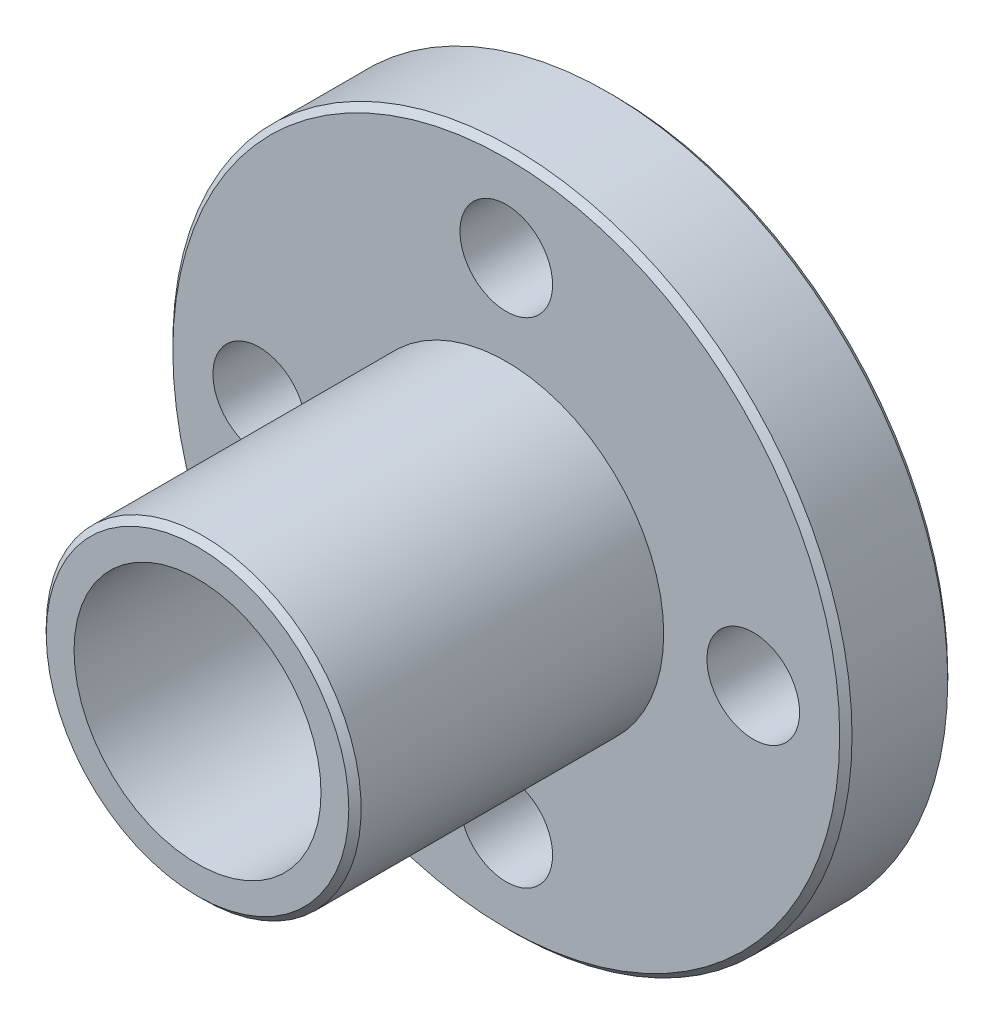
ISO-10303-21;
HEADER;
FILE_DESCRIPTION(('STEP AP214'),'2;1');
FILE_NAME('part.step','',(''),(''),'','','');
FILE_SCHEMA(('AUTOMOTIVE_DESIGN { 1 0 10303 214 1 1 1 1 }'));
ENDSEC;
DATA;
#1=APPLICATION_CONTEXT('core data for automotive mechanical design processes');
#2=APPLICATION_PROTOCOL_DEFINITION('international standard','automotive_design',2000,#1);
#3=PRODUCT_CONTEXT('',#1,'mechanical');
#4=PRODUCT('Part','Part','',(#3));
#5=PRODUCT_RELATED_PRODUCT_CATEGORY('part','',(#4));
#6=PRODUCT_DEFINITION_FORMATION('','',#4);
#7=PRODUCT_DEFINITION_CONTEXT('part definition',#1,'design');
#8=PRODUCT_DEFINITION('design','',#6,#7);
#9=PRODUCT_DEFINITION_SHAPE('','',#8);
#10=(LENGTH_UNIT() NAMED_UNIT(*) SI_UNIT(.MILLI.,.METRE.));
#11=(NAMED_UNIT(*) PLANE_ANGLE_UNIT() SI_UNIT($,.RADIAN.));
#12=(NAMED_UNIT(*) SI_UNIT($,.STERADIAN.) SOLID_ANGLE_UNIT());
#13=UNCERTAINTY_MEASURE_WITH_UNIT(LENGTH_MEASURE(1.E-05),#10,'distance_accuracy_value','');
#14=(GEOMETRIC_REPRESENTATION_CONTEXT(3) GLOBAL_UNCERTAINTY_ASSIGNED_CONTEXT((#13)) GLOBAL_UNIT_ASSIGNED_CONTEXT((#10,
#11,#12)) REPRESENTATION_CONTEXT('',''));
#15=CARTESIAN_POINT('',(0.,0.,0.));
#16=DIRECTION('',(0.,0.,1.));
#17=DIRECTION('',(1.,0.,0.));
#18=AXIS2_PLACEMENT_3D('',#15,#16,#17);
#19=CARTESIAN_POINT('',(0.,0.,0.));
#20=DIRECTION('',(0.,0.,1.));
#21=DIRECTION('',(1.,0.,0.));
#22=AXIS2_PLACEMENT_3D('',#19,#20,#21);
#23=PLANE('',#22);
#24=CARTESIAN_POINT('',(0.,0.,0.));
#25=DIRECTION('',(0.,0.,1.));
#26=DIRECTION('',(1.,0.,0.));
#27=AXIS2_PLACEMENT_3D('',#24,#25,#26);
#28=CIRCLE('',#27,4.9);
#29=CARTESIAN_POINT('',(4.9,0.,0.));
#30=VERTEX_POINT('',#29);
#31=EDGE_CURVE('E63',#30,#30,#28,.F.);
#32=ORIENTED_EDGE('',*,*,#31,.T.);
#33=EDGE_LOOP('',(#32));
#34=FACE_BOUND('',#33,.T.);
#35=CARTESIAN_POINT('',(0.,0.,0.));
#36=DIRECTION('',(0.,0.,1.));
#37=DIRECTION('',(1.,0.,0.));
#38=AXIS2_PLACEMENT_3D('',#35,#36,#37);
#39=CIRCLE('',#38,4.);
#40=CARTESIAN_POINT('',(4.,0.,0.));
#41=VERTEX_POINT('',#40);
#42=EDGE_CURVE('E89',#41,#41,#39,.T.);
#43=ORIENTED_EDGE('',*,*,#42,.T.);
#44=EDGE_LOOP('',(#43));
#45=FACE_BOUND('',#44,.T.);
#46=ADVANCED_FACE('F36',(#34,#45),#23,.F.);
#47=CARTESIAN_POINT('',(0.,0.,1.5));
#48=DIRECTION('',(0.,0.,-1.));
#49=DIRECTION('',(-1.,0.,0.));
#50=AXIS2_PLACEMENT_3D('',#47,#48,#49);
#51=CYLINDRICAL_SURFACE('',#50,5.1);
#52=CARTESIAN_POINT('',(0.,0.,0.200000000000001));
#53=DIRECTION('',(0.,0.,1.));
#54=DIRECTION('',(1.,0.,0.));
#55=AXIS2_PLACEMENT_3D('',#52,#53,#54);
#56=CIRCLE('',#55,5.1);
#57=CARTESIAN_POINT('',(5.1,0.,0.200000000000001));
#58=VERTEX_POINT('',#57);
#59=EDGE_CURVE('E66',#58,#58,#56,.T.);
#60=ORIENTED_EDGE('',*,*,#59,.T.);
#61=EDGE_LOOP('',(#60));
#62=FACE_BOUND('',#61,.T.);
#63=CARTESIAN_POINT('',(0.,0.,1.5));
#64=DIRECTION('',(0.,0.,1.));
#65=DIRECTION('',(1.,0.,0.));
#66=AXIS2_PLACEMENT_3D('',#63,#64,#65);
#67=CIRCLE('',#66,5.1);
#68=CARTESIAN_POINT('',(5.1,0.,1.5));
#69=VERTEX_POINT('',#68);
#70=EDGE_CURVE('E86',#69,#69,#67,.T.);
#71=ORIENTED_EDGE('',*,*,#70,.F.);
#72=EDGE_LOOP('',(#71));
#73=FACE_BOUND('',#72,.T.);
#74=ADVANCED_FACE('F131',(#62,#73),#51,.T.);
#75=CARTESIAN_POINT('',(0.,0.,1.5));
#76=DIRECTION('',(0.,0.,-1.));
#77=DIRECTION('',(-1.,0.,0.));
#78=AXIS2_PLACEMENT_3D('',#75,#76,#77);
#79=CYLINDRICAL_SURFACE('',#78,4.);
#80=ORIENTED_EDGE('',*,*,#42,.F.);
#81=EDGE_LOOP('',(#80));
#82=FACE_BOUND('',#81,.T.);
#83=CARTESIAN_POINT('',(0.,0.,15.));
#84=DIRECTION('',(0.,0.,-1.));
#85=DIRECTION('',(-1.,0.,0.));
#86=AXIS2_PLACEMENT_3D('',#83,#84,#85);
#87=CIRCLE('',#86,4.);
#88=CARTESIAN_POINT('',(-4.,0.,15.));
#89=VERTEX_POINT('',#88);
#90=EDGE_CURVE('E92',#89,#89,#87,.T.);
#91=ORIENTED_EDGE('',*,*,#90,.F.);
#92=EDGE_LOOP('',(#91));
#93=FACE_BOUND('',#92,.T.);
#94=ADVANCED_FACE('F113',(#82,#93),#79,.F.);
#95=CARTESIAN_POINT('',(0.,0.,5.));
#96=DIRECTION('',(0.,0.,1.));
#97=DIRECTION('',(1.,0.,0.));
#98=AXIS2_PLACEMENT_3D('',#95,#96,#97);
#99=PLANE('',#98);
#100=CARTESIAN_POINT('',(0.,0.,5.));
#101=DIRECTION('',(0.,0.,1.));
#102=DIRECTION('',(1.,0.,0.));
#103=AXIS2_PLACEMENT_3D('',#100,#101,#102);
#104=CIRCLE('',#103,10.8);
#105=CARTESIAN_POINT('',(10.8,0.,5.));
#106=VERTEX_POINT('',#105);
#107=EDGE_CURVE('E48',#106,#106,#104,.T.);
#108=ORIENTED_EDGE('',*,*,#107,.T.);
#109=EDGE_LOOP('',(#108));
#110=FACE_BOUND('',#109,.T.);
#111=CARTESIAN_POINT('',(0.,8.,5.));
#112=DIRECTION('',(0.,0.,1.));
#113=DIRECTION('',(1.,0.,0.));
#114=AXIS2_PLACEMENT_3D('',#111,#112,#113);
#115=CIRCLE('',#114,1.5);
#116=CARTESIAN_POINT('',(1.5,8.,5.));
#117=VERTEX_POINT('',#116);
#118=EDGE_CURVE('E73',#117,#117,#115,.T.);
#119=ORIENTED_EDGE('',*,*,#118,.F.);
#120=EDGE_LOOP('',(#119));
#121=FACE_BOUND('',#120,.T.);
#122=CARTESIAN_POINT('',(-8.,0.,5.));
#123=DIRECTION('',(0.,0.,1.));
#124=DIRECTION('',(1.,0.,0.));
#125=AXIS2_PLACEMENT_3D('',#122,#123,#124);
#126=CIRCLE('',#125,1.50000000000003);
#127=CARTESIAN_POINT('',(-6.49999999999997,0.,5.));
#128=VERTEX_POINT('',#127);
#129=EDGE_CURVE('E74',#128,#128,#126,.T.);
#130=ORIENTED_EDGE('',*,*,#129,.F.);
#131=EDGE_LOOP('',(#130));
#132=FACE_BOUND('',#131,.T.);
#133=CARTESIAN_POINT('',(0.,-8.,5.));
#134=DIRECTION('',(0.,0.,1.));
#135=DIRECTION('',(1.,0.,0.));
#136=AXIS2_PLACEMENT_3D('',#133,#134,#135);
#137=CIRCLE('',#136,1.50000000000005);
#138=CARTESIAN_POINT('',(1.50000000000005,-8.,5.));
#139=VERTEX_POINT('',#138);
#140=EDGE_CURVE('E78',#139,#139,#137,.T.);
#141=ORIENTED_EDGE('',*,*,#140,.F.);
#142=EDGE_LOOP('',(#141));
#143=FACE_BOUND('',#142,.T.);
#144=CARTESIAN_POINT('',(8.,0.,5.));
#145=DIRECTION('',(0.,0.,1.));
#146=DIRECTION('',(1.,0.,0.));
#147=AXIS2_PLACEMENT_3D('',#144,#145,#146);
#148=CIRCLE('',#147,1.50000000000008);
#149=CARTESIAN_POINT('',(9.50000000000008,0.,5.));
#150=VERTEX_POINT('',#149);
#151=EDGE_CURVE('E82',#150,#150,#148,.T.);
#152=ORIENTED_EDGE('',*,*,#151,.F.);
#153=EDGE_LOOP('',(#152));
#154=FACE_BOUND('',#153,.T.);
#155=CARTESIAN_POINT('',(0.,0.,5.));
#156=DIRECTION('',(0.,0.,1.));
#157=DIRECTION('',(1.,0.,0.));
#158=AXIS2_PLACEMENT_3D('',#155,#156,#157);
#159=CIRCLE('',#158,5.1);
#160=CARTESIAN_POINT('',(5.1,0.,5.));
#161=VERTEX_POINT('',#160);
#162=EDGE_CURVE('E69',#161,#161,#159,.T.);
#163=ORIENTED_EDGE('',*,*,#162,.F.);
#164=EDGE_LOOP('',(#163));
#165=FACE_BOUND('',#164,.T.);
#166=ADVANCED_FACE('F109',(#110,#121,#132,#143,#154,#165),#99,.T.);
#167=CARTESIAN_POINT('',(0.,0.,1.5));
#168=DIRECTION('',(0.,0.,1.));
#169=DIRECTION('',(1.,0.,0.));
#170=AXIS2_PLACEMENT_3D('',#167,#168,#169);
#171=PLANE('',#170);
#172=CARTESIAN_POINT('',(0.,0.,1.5));
#173=DIRECTION('',(0.,0.,1.));
#174=DIRECTION('',(1.,0.,0.));
#175=AXIS2_PLACEMENT_3D('',#172,#173,#174);
#176=CIRCLE('',#175,10.8);
#177=CARTESIAN_POINT('',(10.8,0.,1.5));
#178=VERTEX_POINT('',#177);
#179=EDGE_CURVE('E52',#178,#178,#176,.F.);
#180=ORIENTED_EDGE('',*,*,#179,.T.);
#181=EDGE_LOOP('',(#180));
#182=FACE_BOUND('',#181,.T.);
#183=CARTESIAN_POINT('',(0.,8.,1.5));
#184=DIRECTION('',(0.,0.,1.));
#185=DIRECTION('',(1.,0.,0.));
#186=AXIS2_PLACEMENT_3D('',#183,#184,#185);
#187=CIRCLE('',#186,1.5);
#188=CARTESIAN_POINT('',(1.5,8.,1.5));
#189=VERTEX_POINT('',#188);
#190=EDGE_CURVE('E70',#189,#189,#187,.T.);
#191=ORIENTED_EDGE('',*,*,#190,.T.);
#192=EDGE_LOOP('',(#191));
#193=FACE_BOUND('',#192,.T.);
#194=CARTESIAN_POINT('',(-8.,0.,1.5));
#195=DIRECTION('',(0.,0.,1.));
#196=DIRECTION('',(1.,0.,0.));
#197=AXIS2_PLACEMENT_3D('',#194,#195,#196);
#198=CIRCLE('',#197,1.50000000000003);
#199=CARTESIAN_POINT('',(-6.49999999999997,0.,1.5));
#200=VERTEX_POINT('',#199);
#201=EDGE_CURVE('E75',#200,#200,#198,.T.);
#202=ORIENTED_EDGE('',*,*,#201,.T.);
#203=EDGE_LOOP('',(#202));
#204=FACE_BOUND('',#203,.T.);
#205=CARTESIAN_POINT('',(0.,-8.,1.5));
#206=DIRECTION('',(0.,0.,1.));
#207=DIRECTION('',(1.,0.,0.));
#208=AXIS2_PLACEMENT_3D('',#205,#206,#207);
#209=CIRCLE('',#208,1.50000000000005);
#210=CARTESIAN_POINT('',(1.50000000000005,-8.,1.5));
#211=VERTEX_POINT('',#210);
#212=EDGE_CURVE('E79',#211,#211,#209,.T.);
#213=ORIENTED_EDGE('',*,*,#212,.T.);
#214=EDGE_LOOP('',(#213));
#215=FACE_BOUND('',#214,.T.);
#216=CARTESIAN_POINT('',(8.,0.,1.5));
#217=DIRECTION('',(0.,0.,1.));
#218=DIRECTION('',(1.,0.,0.));
#219=AXIS2_PLACEMENT_3D('',#216,#217,#218);
#220=CIRCLE('',#219,1.50000000000008);
#221=CARTESIAN_POINT('',(9.50000000000008,0.,1.5));
#222=VERTEX_POINT('',#221);
#223=EDGE_CURVE('E83',#222,#222,#220,.T.);
#224=ORIENTED_EDGE('',*,*,#223,.T.);
#225=EDGE_LOOP('',(#224));
#226=FACE_BOUND('',#225,.T.);
#227=ORIENTED_EDGE('',*,*,#70,.T.);
#228=EDGE_LOOP('',(#227));
#229=FACE_BOUND('',#228,.T.);
#230=ADVANCED_FACE('F112',(#182,#193,#204,#215,#226,#229),#171,.F.);
#231=CARTESIAN_POINT('',(0.,0.,5.));
#232=DIRECTION('',(0.,0.,-1.));
#233=DIRECTION('',(-1.,0.,0.));
#234=AXIS2_PLACEMENT_3D('',#231,#232,#233);
#235=CYLINDRICAL_SURFACE('',#234,11.);
#236=CARTESIAN_POINT('',(0.,0.,1.7));
#237=DIRECTION('',(0.,0.,1.));
#238=DIRECTION('',(1.,0.,0.));
#239=AXIS2_PLACEMENT_3D('',#236,#237,#238);
#240=CIRCLE('',#239,11.);
#241=CARTESIAN_POINT('',(11.,0.,1.7));
#242=VERTEX_POINT('',#241);
#243=EDGE_CURVE('E57',#242,#242,#240,.T.);
#244=ORIENTED_EDGE('',*,*,#243,.T.);
#245=EDGE_LOOP('',(#244));
#246=FACE_BOUND('',#245,.T.);
#247=CARTESIAN_POINT('',(0.,0.,4.79999999999999));
#248=DIRECTION('',(0.,0.,1.));
#249=DIRECTION('',(1.,0.,0.));
#250=AXIS2_PLACEMENT_3D('',#247,#248,#249);
#251=CIRCLE('',#250,11.);
#252=CARTESIAN_POINT('',(11.,0.,4.79999999999999));
#253=VERTEX_POINT('',#252);
#254=EDGE_CURVE('E60',#253,#253,#251,.F.);
#255=ORIENTED_EDGE('',*,*,#254,.T.);
#256=EDGE_LOOP('',(#255));
#257=FACE_BOUND('',#256,.T.);
#258=ADVANCED_FACE('F121',(#246,#257),#235,.T.);
#259=CARTESIAN_POINT('',(0.,0.,15.));
#260=DIRECTION('',(0.,0.,-1.));
#261=DIRECTION('',(-1.,0.,0.));
#262=AXIS2_PLACEMENT_3D('',#259,#260,#261);
#263=CYLINDRICAL_SURFACE('',#262,5.1);
#264=CARTESIAN_POINT('',(0.,0.,14.8));
#265=DIRECTION('',(0.,0.,-1.));
#266=DIRECTION('',(-1.,0.,0.));
#267=AXIS2_PLACEMENT_3D('',#264,#265,#266);
#268=CIRCLE('',#267,5.1);
#269=CARTESIAN_POINT('',(-5.1,0.,14.8));
#270=VERTEX_POINT('',#269);
#271=EDGE_CURVE('E44',#270,#270,#268,.T.);
#272=ORIENTED_EDGE('',*,*,#271,.T.);
#273=EDGE_LOOP('',(#272));
#274=FACE_BOUND('',#273,.T.);
#275=ORIENTED_EDGE('',*,*,#162,.T.);
#276=EDGE_LOOP('',(#275));
#277=FACE_BOUND('',#276,.T.);
#278=ADVANCED_FACE('F118',(#274,#277),#263,.T.);
#279=CARTESIAN_POINT('',(0.,0.,15.));
#280=DIRECTION('',(0.,0.,-1.));
#281=DIRECTION('',(-1.,0.,0.));
#282=AXIS2_PLACEMENT_3D('',#279,#280,#281);
#283=PLANE('',#282);
#284=CARTESIAN_POINT('',(0.,0.,15.));
#285=DIRECTION('',(0.,0.,-1.));
#286=DIRECTION('',(-1.,0.,0.));
#287=AXIS2_PLACEMENT_3D('',#284,#285,#286);
#288=CIRCLE('',#287,4.9);
#289=CARTESIAN_POINT('',(-4.9,0.,15.));
#290=VERTEX_POINT('',#289);
#291=EDGE_CURVE('E10',#290,#290,#288,.F.);
#292=ORIENTED_EDGE('',*,*,#291,.T.);
#293=EDGE_LOOP('',(#292));
#294=FACE_BOUND('',#293,.T.);
#295=ORIENTED_EDGE('',*,*,#90,.T.);
#296=EDGE_LOOP('',(#295));
#297=FACE_BOUND('',#296,.T.);
#298=ADVANCED_FACE('F120',(#294,#297),#283,.F.);
#299=CARTESIAN_POINT('',(8.,0.,15.));
#300=DIRECTION('',(0.,0.,-1.));
#301=DIRECTION('',(-1.,0.,0.));
#302=AXIS2_PLACEMENT_3D('',#299,#300,#301);
#303=CYLINDRICAL_SURFACE('',#302,1.50000000000008);
#304=ORIENTED_EDGE('',*,*,#151,.T.);
#305=EDGE_LOOP('',(#304));
#306=FACE_BOUND('',#305,.T.);
#307=ORIENTED_EDGE('',*,*,#223,.F.);
#308=EDGE_LOOP('',(#307));
#309=FACE_BOUND('',#308,.T.);
#310=ADVANCED_FACE('F106',(#306,#309),#303,.F.);
#311=CARTESIAN_POINT('',(0.,-8.,15.));
#312=DIRECTION('',(0.,0.,-1.));
#313=DIRECTION('',(-1.,0.,0.));
#314=AXIS2_PLACEMENT_3D('',#311,#312,#313);
#315=CYLINDRICAL_SURFACE('',#314,1.50000000000005);
#316=ORIENTED_EDGE('',*,*,#140,.T.);
#317=EDGE_LOOP('',(#316));
#318=FACE_BOUND('',#317,.T.);
#319=ORIENTED_EDGE('',*,*,#212,.F.);
#320=EDGE_LOOP('',(#319));
#321=FACE_BOUND('',#320,.T.);
#322=ADVANCED_FACE('F176',(#318,#321),#315,.F.);
#323=CARTESIAN_POINT('',(-8.,0.,15.));
#324=DIRECTION('',(0.,0.,-1.));
#325=DIRECTION('',(-1.,0.,0.));
#326=AXIS2_PLACEMENT_3D('',#323,#324,#325);
#327=CYLINDRICAL_SURFACE('',#326,1.50000000000003);
#328=ORIENTED_EDGE('',*,*,#129,.T.);
#329=EDGE_LOOP('',(#328));
#330=FACE_BOUND('',#329,.T.);
#331=ORIENTED_EDGE('',*,*,#201,.F.);
#332=EDGE_LOOP('',(#331));
#333=FACE_BOUND('',#332,.T.);
#334=ADVANCED_FACE('F179',(#330,#333),#327,.F.);
#335=CARTESIAN_POINT('',(0.,8.,15.));
#336=DIRECTION('',(0.,0.,-1.));
#337=DIRECTION('',(-1.,0.,0.));
#338=AXIS2_PLACEMENT_3D('',#335,#336,#337);
#339=CYLINDRICAL_SURFACE('',#338,1.5);
#340=ORIENTED_EDGE('',*,*,#118,.T.);
#341=EDGE_LOOP('',(#340));
#342=FACE_BOUND('',#341,.T.);
#343=ORIENTED_EDGE('',*,*,#190,.F.);
#344=EDGE_LOOP('',(#343));
#345=FACE_BOUND('',#344,.T.);
#346=ADVANCED_FACE('F150',(#342,#345),#339,.F.);
#347=CARTESIAN_POINT('',(0.,0.,0.200000000000001));
#348=DIRECTION('',(0.,0.,1.));
#349=DIRECTION('',(1.,0.,0.));
#350=AXIS2_PLACEMENT_3D('',#347,#348,#349);
#351=CONICAL_SURFACE('',#350,5.1,0.785398163397448);
#352=ORIENTED_EDGE('',*,*,#31,.F.);
#353=EDGE_LOOP('',(#352));
#354=FACE_BOUND('',#353,.T.);
#355=ORIENTED_EDGE('',*,*,#59,.F.);
#356=EDGE_LOOP('',(#355));
#357=FACE_BOUND('',#356,.T.);
#358=ADVANCED_FACE('F143',(#354,#357),#351,.T.);
#359=CARTESIAN_POINT('',(0.,0.,1.7));
#360=DIRECTION('',(0.,0.,1.));
#361=DIRECTION('',(1.,0.,0.));
#362=AXIS2_PLACEMENT_3D('',#359,#360,#361);
#363=CONICAL_SURFACE('',#362,11.,0.785398163397448);
#364=ORIENTED_EDGE('',*,*,#179,.F.);
#365=EDGE_LOOP('',(#364));
#366=FACE_BOUND('',#365,.T.);
#367=ORIENTED_EDGE('',*,*,#243,.F.);
#368=EDGE_LOOP('',(#367));
#369=FACE_BOUND('',#368,.T.);
#370=ADVANCED_FACE('F149',(#366,#369),#363,.T.);
#371=CARTESIAN_POINT('',(0.,0.,5.));
#372=DIRECTION('',(0.,0.,-1.));
#373=DIRECTION('',(-1.,0.,0.));
#374=AXIS2_PLACEMENT_3D('',#371,#372,#373);
#375=CONICAL_SURFACE('',#374,10.8,0.785398163397448);
#376=ORIENTED_EDGE('',*,*,#254,.F.);
#377=EDGE_LOOP('',(#376));
#378=FACE_BOUND('',#377,.T.);
#379=ORIENTED_EDGE('',*,*,#107,.F.);
#380=EDGE_LOOP('',(#379));
#381=FACE_BOUND('',#380,.T.);
#382=ADVANCED_FACE('F156',(#378,#381),#375,.T.);
#383=CARTESIAN_POINT('',(0.,0.,14.8));
#384=DIRECTION('',(0.,0.,-1.));
#385=DIRECTION('',(-1.,0.,0.));
#386=AXIS2_PLACEMENT_3D('',#383,#384,#385);
#387=CONICAL_SURFACE('',#386,5.1,0.785398163397446);
#388=ORIENTED_EDGE('',*,*,#291,.F.);
#389=EDGE_LOOP('',(#388));
#390=FACE_BOUND('',#389,.T.);
#391=ORIENTED_EDGE('',*,*,#271,.F.);
#392=EDGE_LOOP('',(#391));
#393=FACE_BOUND('',#392,.T.);
#394=ADVANCED_FACE('F39',(#390,#393),#387,.T.);
#395=CLOSED_SHELL('',(#46,#74,#94,#166,#230,#258,#278,#298,#310,#322,#334,#346,#358,#370,#382,#394));
#396=MANIFOLD_SOLID_BREP('B2',#395);
#397=ADVANCED_BREP_SHAPE_REPRESENTATION('',(#18,#396),#14);
#398=SHAPE_DEFINITION_REPRESENTATION(#9,#397);
ENDSEC;
END-ISO-10303-21;
